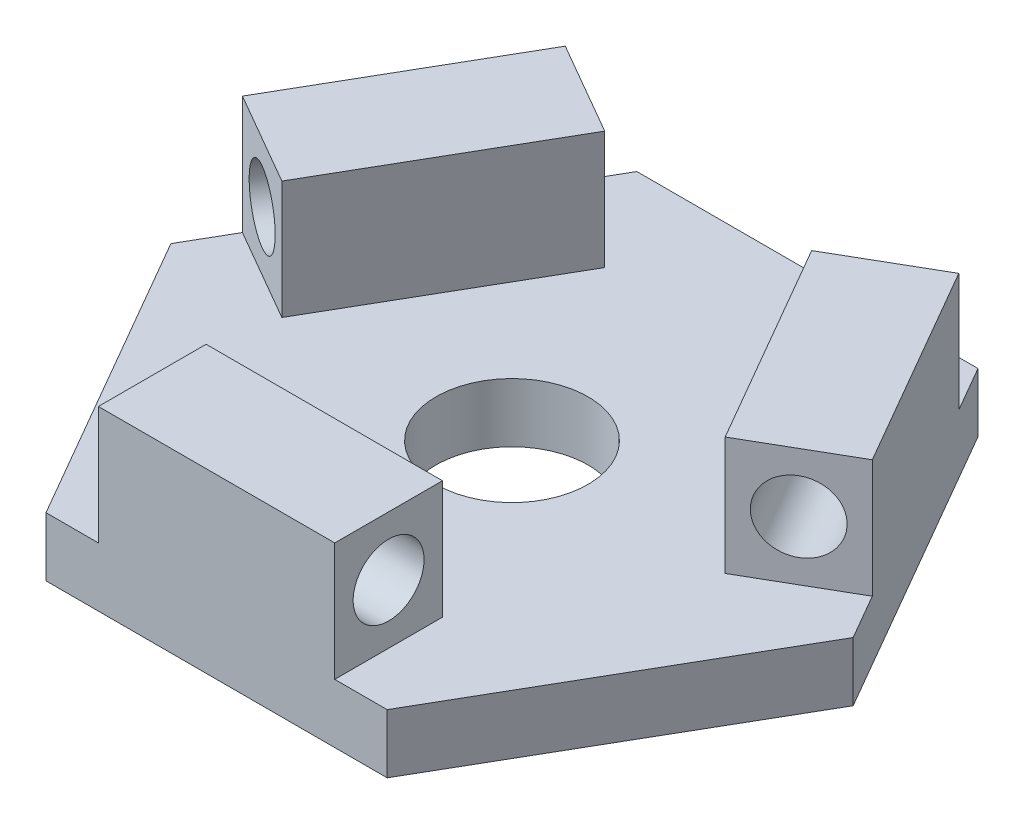
ISO-10303-21;
HEADER;
FILE_DESCRIPTION(('STEP AP214'),'2;1');
FILE_NAME('part.step','',(''),(''),'','','');
FILE_SCHEMA(('AUTOMOTIVE_DESIGN { 1 0 10303 214 1 1 1 1 }'));
ENDSEC;
DATA;
#1=APPLICATION_CONTEXT('core data for automotive mechanical design processes');
#2=APPLICATION_PROTOCOL_DEFINITION('international standard','automotive_design',2000,#1);
#3=PRODUCT_CONTEXT('',#1,'mechanical');
#4=PRODUCT('Part','Part','',(#3));
#5=PRODUCT_RELATED_PRODUCT_CATEGORY('part','',(#4));
#6=PRODUCT_DEFINITION_FORMATION('','',#4);
#7=PRODUCT_DEFINITION_CONTEXT('part definition',#1,'design');
#8=PRODUCT_DEFINITION('design','',#6,#7);
#9=PRODUCT_DEFINITION_SHAPE('','',#8);
#10=(LENGTH_UNIT() NAMED_UNIT(*) SI_UNIT(.MILLI.,.METRE.));
#11=(NAMED_UNIT(*) PLANE_ANGLE_UNIT() SI_UNIT($,.RADIAN.));
#12=(NAMED_UNIT(*) SI_UNIT($,.STERADIAN.) SOLID_ANGLE_UNIT());
#13=UNCERTAINTY_MEASURE_WITH_UNIT(LENGTH_MEASURE(1.E-05),#10,'distance_accuracy_value','');
#14=(GEOMETRIC_REPRESENTATION_CONTEXT(3) GLOBAL_UNCERTAINTY_ASSIGNED_CONTEXT((#13)) GLOBAL_UNIT_ASSIGNED_CONTEXT((#10,
#11,#12)) REPRESENTATION_CONTEXT('',''));
#15=CARTESIAN_POINT('',(0.,0.,0.));
#16=DIRECTION('',(0.,0.,1.));
#17=DIRECTION('',(1.,0.,0.));
#18=AXIS2_PLACEMENT_3D('',#15,#16,#17);
#19=CARTESIAN_POINT('',(0.,5.,0.));
#20=DIRECTION('',(0.,1.,0.));
#21=DIRECTION('',(0.,0.,1.));
#22=AXIS2_PLACEMENT_3D('',#19,#20,#21);
#23=PLANE('',#22);
#24=CARTESIAN_POINT('',(0.,5.,0.));
#25=DIRECTION('',(0.,1.,0.));
#26=DIRECTION('',(0.,0.,1.));
#27=AXIS2_PLACEMENT_3D('',#24,#25,#26);
#28=CIRCLE('',#27,6.43081059740745);
#29=CARTESIAN_POINT('',(0.,5.,6.43081059740745));
#30=VERTEX_POINT('',#29);
#31=EDGE_CURVE('E366',#30,#30,#28,.T.);
#32=ORIENTED_EDGE('',*,*,#31,.F.);
#33=EDGE_LOOP('',(#32));
#34=FACE_BOUND('',#33,.T.);
#35=DIRECTION('',(0.499999999999992,0.,-0.866025403784443));
#36=VECTOR('',#35,1.);
#37=CARTESIAN_POINT('',(-8.75565067167578,5.,-16.6020826560147));
#38=LINE('',#37,#36);
#39=CARTESIAN_POINT('',(-18.7556506716756,5.,0.718425419674186));
#40=VERTEX_POINT('',#39);
#41=CARTESIAN_POINT('',(-8.75565067167578,5.,-16.6020826560147));
#42=VERTEX_POINT('',#41);
#43=EDGE_CURVE('E52',#40,#42,#38,.T.);
#44=ORIENTED_EDGE('',*,*,#43,.F.);
#45=DIRECTION('',(0.866025403784443,0.,0.499999999999992));
#46=VECTOR('',#45,1.);
#47=CARTESIAN_POINT('',(-18.7556506716756,5.,0.718425419674186));
#48=LINE('',#47,#46);
#49=CARTESIAN_POINT('',(-26.650635094611,5.,-3.83974596215537));
#50=VERTEX_POINT('',#49);
#51=EDGE_CURVE('E182',#50,#40,#48,.T.);
#52=ORIENTED_EDGE('',*,*,#51,.F.);
#53=DIRECTION('',(-0.5,0.,0.866025403784439));
#54=VECTOR('',#53,1.);
#55=CARTESIAN_POINT('',(-14.4337567297406,5.,-25.));
#56=LINE('',#55,#54);
#57=CARTESIAN_POINT('',(-28.8675134594813,5.,0.));
#58=VERTEX_POINT('',#57);
#59=EDGE_CURVE('E389',#50,#58,#56,.T.);
#60=ORIENTED_EDGE('',*,*,#59,.T.);
#61=DIRECTION('',(0.5,0.,0.866025403784438));
#62=VECTOR('',#61,1.);
#63=CARTESIAN_POINT('',(-28.8675134594813,5.,0.));
#64=LINE('',#63,#62);
#65=CARTESIAN_POINT('',(-14.4337567297406,5.,25.));
#66=VERTEX_POINT('',#65);
#67=EDGE_CURVE('E375',#58,#66,#64,.T.);
#68=ORIENTED_EDGE('',*,*,#67,.T.);
#69=DIRECTION('',(1.,0.,0.));
#70=VECTOR('',#69,1.);
#71=CARTESIAN_POINT('',(-14.4337567297406,5.,25.));
#72=LINE('',#71,#70);
#73=CARTESIAN_POINT('',(-9.99999999999999,5.,25.));
#74=VERTEX_POINT('',#73);
#75=EDGE_CURVE('E367',#66,#74,#72,.T.);
#76=ORIENTED_EDGE('',*,*,#75,.T.);
#77=DIRECTION('',(0.,0.,1.));
#78=VECTOR('',#77,1.);
#79=CARTESIAN_POINT('',(-10.,5.,15.8836572363408));
#80=LINE('',#79,#78);
#81=CARTESIAN_POINT('',(-10.,5.,15.8836572363408));
#82=VERTEX_POINT('',#81);
#83=EDGE_CURVE('E226',#82,#74,#80,.T.);
#84=ORIENTED_EDGE('',*,*,#83,.F.);
#85=DIRECTION('',(-1.,0.,0.));
#86=VECTOR('',#85,1.);
#87=CARTESIAN_POINT('',(-10.,5.,15.8836572363408));
#88=LINE('',#87,#86);
#89=CARTESIAN_POINT('',(10.,5.,15.8836572363408));
#90=VERTEX_POINT('',#89);
#91=EDGE_CURVE('E233',#90,#82,#88,.T.);
#92=ORIENTED_EDGE('',*,*,#91,.F.);
#93=DIRECTION('',(0.,0.,-1.));
#94=VECTOR('',#93,1.);
#95=CARTESIAN_POINT('',(10.,5.,15.8836572363408));
#96=LINE('',#95,#94);
#97=CARTESIAN_POINT('',(10.,5.,25.));
#98=VERTEX_POINT('',#97);
#99=EDGE_CURVE('E236',#98,#90,#96,.T.);
#100=ORIENTED_EDGE('',*,*,#99,.F.);
#101=CARTESIAN_POINT('',(14.4337567297407,5.,25.));
#102=VERTEX_POINT('',#101);
#103=EDGE_CURVE('E370',#98,#102,#72,.T.);
#104=ORIENTED_EDGE('',*,*,#103,.T.);
#105=DIRECTION('',(0.5,0.,-0.866025403784439));
#106=VECTOR('',#105,1.);
#107=CARTESIAN_POINT('',(14.4337567297407,5.,25.));
#108=LINE('',#107,#106);
#109=CARTESIAN_POINT('',(28.8675134594813,5.,0.));
#110=VERTEX_POINT('',#109);
#111=EDGE_CURVE('E356',#102,#110,#108,.T.);
#112=ORIENTED_EDGE('',*,*,#111,.T.);
#113=DIRECTION('',(-0.5,0.,-0.866025403784439));
#114=VECTOR('',#113,1.);
#115=CARTESIAN_POINT('',(28.8675134594813,5.,0.));
#116=LINE('',#115,#114);
#117=CARTESIAN_POINT('',(26.6506350946109,5.,-3.83974596215572));
#118=VERTEX_POINT('',#117);
#119=EDGE_CURVE('E391',#110,#118,#116,.T.);
#120=ORIENTED_EDGE('',*,*,#119,.T.);
#121=DIRECTION('',(0.866025403784436,0.,-0.500000000000004));
#122=VECTOR('',#121,1.);
#123=CARTESIAN_POINT('',(18.7556506716756,5.,0.718425419673921));
#124=LINE('',#123,#122);
#125=CARTESIAN_POINT('',(18.7556506716756,5.,0.718425419673922));
#126=VERTEX_POINT('',#125);
#127=EDGE_CURVE('E196',#126,#118,#124,.T.);
#128=ORIENTED_EDGE('',*,*,#127,.F.);
#129=DIRECTION('',(0.500000000000004,0.,0.866025403784437));
#130=VECTOR('',#129,1.);
#131=CARTESIAN_POINT('',(18.7556506716756,5.,0.718425419673921));
#132=LINE('',#131,#130);
#133=CARTESIAN_POINT('',(8.75565067167555,5.,-16.6020826560148));
#134=VERTEX_POINT('',#133);
#135=EDGE_CURVE('E186',#134,#126,#132,.T.);
#136=ORIENTED_EDGE('',*,*,#135,.F.);
#137=DIRECTION('',(-0.866025403784436,0.,0.500000000000004));
#138=VECTOR('',#137,1.);
#139=CARTESIAN_POINT('',(8.75565067167555,5.,-16.6020826560148));
#140=LINE('',#139,#138);
#141=CARTESIAN_POINT('',(16.6506350946109,5.,-21.1602540378445));
#142=VERTEX_POINT('',#141);
#143=EDGE_CURVE('E183',#142,#134,#140,.T.);
#144=ORIENTED_EDGE('',*,*,#143,.F.);
#145=CARTESIAN_POINT('',(14.4337567297406,5.,-25.));
#146=VERTEX_POINT('',#145);
#147=EDGE_CURVE('E351',#142,#146,#116,.T.);
#148=ORIENTED_EDGE('',*,*,#147,.T.);
#149=DIRECTION('',(-1.,0.,0.));
#150=VECTOR('',#149,1.);
#151=CARTESIAN_POINT('',(14.4337567297406,5.,-25.));
#152=LINE('',#151,#150);
#153=CARTESIAN_POINT('',(-14.4337567297406,5.,-25.));
#154=VERTEX_POINT('',#153);
#155=EDGE_CURVE('E390',#146,#154,#152,.T.);
#156=ORIENTED_EDGE('',*,*,#155,.T.);
#157=CARTESIAN_POINT('',(-16.650635094611,5.,-21.1602540378442));
#158=VERTEX_POINT('',#157);
#159=EDGE_CURVE('E278',#154,#158,#56,.T.);
#160=ORIENTED_EDGE('',*,*,#159,.T.);
#161=DIRECTION('',(-0.866025403784443,0.,-0.499999999999992));
#162=VECTOR('',#161,1.);
#163=CARTESIAN_POINT('',(-8.75565067167578,5.,-16.6020826560147));
#164=LINE('',#163,#162);
#165=EDGE_CURVE('E57',#42,#158,#164,.T.);
#166=ORIENTED_EDGE('',*,*,#165,.F.);
#167=EDGE_LOOP('',(#44,#52,#60,#68,#76,#84,#92,#100,#104,#112,#120,#128,#136,#144,#148,#156,
#160,#166));
#168=FACE_BOUND('',#167,.T.);
#169=ADVANCED_FACE('F35',(#34,#168),#23,.T.);
#170=CARTESIAN_POINT('',(28.8675134594813,5.,0.));
#171=DIRECTION('',(-0.866025403784439,0.,0.5));
#172=DIRECTION('',(0.5,0.,0.866025403784439));
#173=AXIS2_PLACEMENT_3D('',#170,#171,#172);
#174=PLANE('',#173);
#175=DIRECTION('',(-0.5,0.,-0.866025403784439));
#176=VECTOR('',#175,1.);
#177=CARTESIAN_POINT('',(28.8675134594813,0.,0.));
#178=LINE('',#177,#176);
#179=CARTESIAN_POINT('',(28.8675134594813,0.,0.));
#180=VERTEX_POINT('',#179);
#181=CARTESIAN_POINT('',(14.4337567297406,0.,-25.));
#182=VERTEX_POINT('',#181);
#183=EDGE_CURVE('E334',#180,#182,#178,.T.);
#184=ORIENTED_EDGE('',*,*,#183,.T.);
#185=DIRECTION('',(0.,-1.,0.));
#186=VECTOR('',#185,1.);
#187=CARTESIAN_POINT('',(14.4337567297406,5.,-25.));
#188=LINE('',#187,#186);
#189=EDGE_CURVE('E11',#146,#182,#188,.T.);
#190=ORIENTED_EDGE('',*,*,#189,.F.);
#191=ORIENTED_EDGE('',*,*,#147,.F.);
#192=DIRECTION('',(0.,-1.,0.));
#193=VECTOR('',#192,1.);
#194=CARTESIAN_POINT('',(16.6506350946109,15.,-21.1602540378445));
#195=LINE('',#194,#193);
#196=CARTESIAN_POINT('',(16.6506350946109,15.,-21.1602540378445));
#197=VERTEX_POINT('',#196);
#198=EDGE_CURVE('E201',#197,#142,#195,.T.);
#199=ORIENTED_EDGE('',*,*,#198,.F.);
#200=DIRECTION('',(-0.500000000000004,0.,-0.866025403784436));
#201=VECTOR('',#200,1.);
#202=CARTESIAN_POINT('',(26.650635094611,15.,-3.83974596215575));
#203=LINE('',#202,#201);
#204=CARTESIAN_POINT('',(26.650635094611,15.,-3.83974596215575));
#205=VERTEX_POINT('',#204);
#206=EDGE_CURVE('E200',#205,#197,#203,.T.);
#207=ORIENTED_EDGE('',*,*,#206,.F.);
#208=DIRECTION('',(0.,-1.,0.));
#209=VECTOR('',#208,1.);
#210=CARTESIAN_POINT('',(26.650635094611,15.,-3.83974596215575));
#211=LINE('',#210,#209);
#212=EDGE_CURVE('E209',#205,#118,#211,.T.);
#213=ORIENTED_EDGE('',*,*,#212,.T.);
#214=ORIENTED_EDGE('',*,*,#119,.F.);
#215=DIRECTION('',(0.,-1.,0.));
#216=VECTOR('',#215,1.);
#217=CARTESIAN_POINT('',(28.8675134594813,5.,0.));
#218=LINE('',#217,#216);
#219=EDGE_CURVE('E352',#110,#180,#218,.T.);
#220=ORIENTED_EDGE('',*,*,#219,.T.);
#221=EDGE_LOOP('',(#184,#190,#191,#199,#207,#213,#214,#220));
#222=FACE_BOUND('',#221,.T.);
#223=ADVANCED_FACE('F37',(#222),#174,.F.);
#224=CARTESIAN_POINT('',(14.4337567297406,5.,-25.));
#225=DIRECTION('',(0.,0.,1.));
#226=DIRECTION('',(1.,0.,0.));
#227=AXIS2_PLACEMENT_3D('',#224,#225,#226);
#228=PLANE('',#227);
#229=DIRECTION('',(-1.,0.,0.));
#230=VECTOR('',#229,1.);
#231=CARTESIAN_POINT('',(14.4337567297406,0.,-25.));
#232=LINE('',#231,#230);
#233=CARTESIAN_POINT('',(-14.4337567297406,0.,-25.));
#234=VERTEX_POINT('',#233);
#235=EDGE_CURVE('E326',#182,#234,#232,.T.);
#236=ORIENTED_EDGE('',*,*,#235,.T.);
#237=DIRECTION('',(0.,-1.,0.));
#238=VECTOR('',#237,1.);
#239=CARTESIAN_POINT('',(-14.4337567297406,5.,-25.));
#240=LINE('',#239,#238);
#241=EDGE_CURVE('E44',#154,#234,#240,.T.);
#242=ORIENTED_EDGE('',*,*,#241,.F.);
#243=ORIENTED_EDGE('',*,*,#155,.F.);
#244=ORIENTED_EDGE('',*,*,#189,.T.);
#245=EDGE_LOOP('',(#236,#242,#243,#244));
#246=FACE_BOUND('',#245,.T.);
#247=ADVANCED_FACE('F297',(#246),#228,.F.);
#248=CARTESIAN_POINT('',(-14.4337567297406,5.,-25.));
#249=DIRECTION('',(0.866025403784439,0.,0.5));
#250=DIRECTION('',(0.5,0.,-0.866025403784439));
#251=AXIS2_PLACEMENT_3D('',#248,#249,#250);
#252=PLANE('',#251);
#253=DIRECTION('',(-0.5,0.,0.866025403784439));
#254=VECTOR('',#253,1.);
#255=CARTESIAN_POINT('',(-14.4337567297406,0.,-25.));
#256=LINE('',#255,#254);
#257=CARTESIAN_POINT('',(-28.8675134594813,0.,0.));
#258=VERTEX_POINT('',#257);
#259=EDGE_CURVE('E333',#234,#258,#256,.T.);
#260=ORIENTED_EDGE('',*,*,#259,.T.);
#261=DIRECTION('',(0.,-1.,0.));
#262=VECTOR('',#261,1.);
#263=CARTESIAN_POINT('',(-28.8675134594813,5.,0.));
#264=LINE('',#263,#262);
#265=EDGE_CURVE('E338',#58,#258,#264,.T.);
#266=ORIENTED_EDGE('',*,*,#265,.F.);
#267=ORIENTED_EDGE('',*,*,#59,.F.);
#268=DIRECTION('',(0.,-1.,0.));
#269=VECTOR('',#268,1.);
#270=CARTESIAN_POINT('',(-26.650635094611,15.,-3.83974596215537));
#271=LINE('',#270,#269);
#272=CARTESIAN_POINT('',(-26.650635094611,15.,-3.83974596215537));
#273=VERTEX_POINT('',#272);
#274=EDGE_CURVE('E268',#273,#50,#271,.T.);
#275=ORIENTED_EDGE('',*,*,#274,.F.);
#276=DIRECTION('',(-0.499999999999992,0.,0.866025403784443));
#277=VECTOR('',#276,1.);
#278=CARTESIAN_POINT('',(-16.6506350946112,15.,-21.1602540378442));
#279=LINE('',#278,#277);
#280=CARTESIAN_POINT('',(-16.6506350946112,15.,-21.1602540378442));
#281=VERTEX_POINT('',#280);
#282=EDGE_CURVE('E176',#281,#273,#279,.T.);
#283=ORIENTED_EDGE('',*,*,#282,.F.);
#284=DIRECTION('',(0.,-1.,0.));
#285=VECTOR('',#284,1.);
#286=CARTESIAN_POINT('',(-16.6506350946112,15.,-21.1602540378442));
#287=LINE('',#286,#285);
#288=EDGE_CURVE('E188',#281,#158,#287,.T.);
#289=ORIENTED_EDGE('',*,*,#288,.T.);
#290=ORIENTED_EDGE('',*,*,#159,.F.);
#291=ORIENTED_EDGE('',*,*,#241,.T.);
#292=EDGE_LOOP('',(#260,#266,#267,#275,#283,#289,#290,#291));
#293=FACE_BOUND('',#292,.T.);
#294=ADVANCED_FACE('F276',(#293),#252,.F.);
#295=CARTESIAN_POINT('',(-28.8675134594813,5.,0.));
#296=DIRECTION('',(0.866025403784438,0.,-0.5));
#297=DIRECTION('',(-0.5,0.,-0.866025403784438));
#298=AXIS2_PLACEMENT_3D('',#295,#296,#297);
#299=PLANE('',#298);
#300=DIRECTION('',(0.5,0.,0.866025403784438));
#301=VECTOR('',#300,1.);
#302=CARTESIAN_POINT('',(-28.8675134594813,0.,0.));
#303=LINE('',#302,#301);
#304=CARTESIAN_POINT('',(-14.4337567297406,0.,25.));
#305=VERTEX_POINT('',#304);
#306=EDGE_CURVE('E342',#258,#305,#303,.T.);
#307=ORIENTED_EDGE('',*,*,#306,.T.);
#308=DIRECTION('',(0.,-1.,0.));
#309=VECTOR('',#308,1.);
#310=CARTESIAN_POINT('',(-14.4337567297406,5.,25.));
#311=LINE('',#310,#309);
#312=EDGE_CURVE('E359',#66,#305,#311,.T.);
#313=ORIENTED_EDGE('',*,*,#312,.F.);
#314=ORIENTED_EDGE('',*,*,#67,.F.);
#315=ORIENTED_EDGE('',*,*,#265,.T.);
#316=EDGE_LOOP('',(#307,#313,#314,#315));
#317=FACE_BOUND('',#316,.T.);
#318=ADVANCED_FACE('F315',(#317),#299,.F.);
#319=CARTESIAN_POINT('',(-14.4337567297406,5.,25.));
#320=DIRECTION('',(0.,0.,-1.));
#321=DIRECTION('',(-1.,0.,0.));
#322=AXIS2_PLACEMENT_3D('',#319,#320,#321);
#323=PLANE('',#322);
#324=DIRECTION('',(1.,0.,0.));
#325=VECTOR('',#324,1.);
#326=CARTESIAN_POINT('',(-14.4337567297406,0.,25.));
#327=LINE('',#326,#325);
#328=CARTESIAN_POINT('',(14.4337567297407,0.,25.));
#329=VERTEX_POINT('',#328);
#330=EDGE_CURVE('E344',#305,#329,#327,.T.);
#331=ORIENTED_EDGE('',*,*,#330,.T.);
#332=DIRECTION('',(0.,-1.,0.));
#333=VECTOR('',#332,1.);
#334=CARTESIAN_POINT('',(14.4337567297407,5.,25.));
#335=LINE('',#334,#333);
#336=EDGE_CURVE('E355',#102,#329,#335,.T.);
#337=ORIENTED_EDGE('',*,*,#336,.F.);
#338=ORIENTED_EDGE('',*,*,#103,.F.);
#339=DIRECTION('',(0.,-1.,0.));
#340=VECTOR('',#339,1.);
#341=CARTESIAN_POINT('',(10.,15.,25.));
#342=LINE('',#341,#340);
#343=CARTESIAN_POINT('',(10.,15.,25.));
#344=VERTEX_POINT('',#343);
#345=EDGE_CURVE('E232',#344,#98,#342,.T.);
#346=ORIENTED_EDGE('',*,*,#345,.F.);
#347=DIRECTION('',(1.,0.,0.));
#348=VECTOR('',#347,1.);
#349=CARTESIAN_POINT('',(-9.99999999999999,15.,25.));
#350=LINE('',#349,#348);
#351=CARTESIAN_POINT('',(-9.99999999999999,15.,25.));
#352=VERTEX_POINT('',#351);
#353=EDGE_CURVE('E230',#352,#344,#350,.T.);
#354=ORIENTED_EDGE('',*,*,#353,.F.);
#355=DIRECTION('',(0.,-1.,0.));
#356=VECTOR('',#355,1.);
#357=CARTESIAN_POINT('',(-9.99999999999999,15.,25.));
#358=LINE('',#357,#356);
#359=EDGE_CURVE('E247',#352,#74,#358,.T.);
#360=ORIENTED_EDGE('',*,*,#359,.T.);
#361=ORIENTED_EDGE('',*,*,#75,.F.);
#362=ORIENTED_EDGE('',*,*,#312,.T.);
#363=EDGE_LOOP('',(#331,#337,#338,#346,#354,#360,#361,#362));
#364=FACE_BOUND('',#363,.T.);
#365=ADVANCED_FACE('F311',(#364),#323,.F.);
#366=CARTESIAN_POINT('',(14.4337567297407,5.,25.));
#367=DIRECTION('',(-0.866025403784439,0.,-0.5));
#368=DIRECTION('',(-0.5,0.,0.866025403784439));
#369=AXIS2_PLACEMENT_3D('',#366,#367,#368);
#370=PLANE('',#369);
#371=DIRECTION('',(0.5,0.,-0.866025403784439));
#372=VECTOR('',#371,1.);
#373=CARTESIAN_POINT('',(14.4337567297407,0.,25.));
#374=LINE('',#373,#372);
#375=EDGE_CURVE('E349',#329,#180,#374,.T.);
#376=ORIENTED_EDGE('',*,*,#375,.T.);
#377=ORIENTED_EDGE('',*,*,#219,.F.);
#378=ORIENTED_EDGE('',*,*,#111,.F.);
#379=ORIENTED_EDGE('',*,*,#336,.T.);
#380=EDGE_LOOP('',(#376,#377,#378,#379));
#381=FACE_BOUND('',#380,.T.);
#382=ADVANCED_FACE('F307',(#381),#370,.F.);
#383=CARTESIAN_POINT('',(0.,0.,0.));
#384=DIRECTION('',(0.,1.,0.));
#385=DIRECTION('',(0.,0.,1.));
#386=AXIS2_PLACEMENT_3D('',#383,#384,#385);
#387=PLANE('',#386);
#388=CARTESIAN_POINT('',(0.,0.,0.));
#389=DIRECTION('',(0.,1.,0.));
#390=DIRECTION('',(0.,0.,1.));
#391=AXIS2_PLACEMENT_3D('',#388,#389,#390);
#392=CIRCLE('',#391,6.43081059740745);
#393=CARTESIAN_POINT('',(0.,0.,6.43081059740745));
#394=VERTEX_POINT('',#393);
#395=EDGE_CURVE('E363',#394,#394,#392,.T.);
#396=ORIENTED_EDGE('',*,*,#395,.T.);
#397=EDGE_LOOP('',(#396));
#398=FACE_BOUND('',#397,.T.);
#399=ORIENTED_EDGE('',*,*,#183,.F.);
#400=ORIENTED_EDGE('',*,*,#375,.F.);
#401=ORIENTED_EDGE('',*,*,#330,.F.);
#402=ORIENTED_EDGE('',*,*,#306,.F.);
#403=ORIENTED_EDGE('',*,*,#259,.F.);
#404=ORIENTED_EDGE('',*,*,#235,.F.);
#405=EDGE_LOOP('',(#399,#400,#401,#402,#403,#404));
#406=FACE_BOUND('',#405,.T.);
#407=ADVANCED_FACE('F304',(#398,#406),#387,.F.);
#408=CARTESIAN_POINT('',(0.,-5.,0.));
#409=DIRECTION('',(0.,1.,0.));
#410=DIRECTION('',(0.,0.,1.));
#411=AXIS2_PLACEMENT_3D('',#408,#409,#410);
#412=CYLINDRICAL_SURFACE('',#411,6.43081059740745);
#413=ORIENTED_EDGE('',*,*,#31,.T.);
#414=EDGE_LOOP('',(#413));
#415=FACE_BOUND('',#414,.T.);
#416=ORIENTED_EDGE('',*,*,#395,.F.);
#417=EDGE_LOOP('',(#416));
#418=FACE_BOUND('',#417,.T.);
#419=ADVANCED_FACE('F302',(#415,#418),#412,.F.);
#420=CARTESIAN_POINT('',(10.,15.,15.8836572363408));
#421=DIRECTION('',(-1.,0.,0.));
#422=DIRECTION('',(0.,0.,1.));
#423=AXIS2_PLACEMENT_3D('',#420,#421,#422);
#424=PLANE('',#423);
#425=CARTESIAN_POINT('',(10.,10.,20.4418286181704));
#426=DIRECTION('',(1.,0.,0.));
#427=DIRECTION('',(0.,0.,-1.));
#428=AXIS2_PLACEMENT_3D('',#425,#426,#427);
#429=CIRCLE('',#428,3.);
#430=CARTESIAN_POINT('',(10.,10.,17.4418286181704));
#431=VERTEX_POINT('',#430);
#432=EDGE_CURVE('E218',#431,#431,#429,.T.);
#433=ORIENTED_EDGE('',*,*,#432,.F.);
#434=EDGE_LOOP('',(#433));
#435=FACE_BOUND('',#434,.T.);
#436=ORIENTED_EDGE('',*,*,#99,.T.);
#437=DIRECTION('',(0.,-1.,0.));
#438=VECTOR('',#437,1.);
#439=CARTESIAN_POINT('',(10.,15.,15.8836572363408));
#440=LINE('',#439,#438);
#441=CARTESIAN_POINT('',(10.,15.,15.8836572363408));
#442=VERTEX_POINT('',#441);
#443=EDGE_CURVE('E396',#442,#90,#440,.T.);
#444=ORIENTED_EDGE('',*,*,#443,.F.);
#445=DIRECTION('',(0.,0.,-1.));
#446=VECTOR('',#445,1.);
#447=CARTESIAN_POINT('',(10.,15.,15.8836572363408));
#448=LINE('',#447,#446);
#449=EDGE_CURVE('E222',#344,#442,#448,.T.);
#450=ORIENTED_EDGE('',*,*,#449,.F.);
#451=ORIENTED_EDGE('',*,*,#345,.T.);
#452=EDGE_LOOP('',(#436,#444,#450,#451));
#453=FACE_BOUND('',#452,.T.);
#454=ADVANCED_FACE('F445',(#435,#453),#424,.F.);
#455=CARTESIAN_POINT('',(-10.,15.,15.8836572363408));
#456=DIRECTION('',(0.,0.,1.));
#457=DIRECTION('',(1.,0.,0.));
#458=AXIS2_PLACEMENT_3D('',#455,#456,#457);
#459=PLANE('',#458);
#460=ORIENTED_EDGE('',*,*,#91,.T.);
#461=DIRECTION('',(0.,-1.,0.));
#462=VECTOR('',#461,1.);
#463=CARTESIAN_POINT('',(-10.,15.,15.8836572363408));
#464=LINE('',#463,#462);
#465=CARTESIAN_POINT('',(-10.,15.,15.8836572363408));
#466=VERTEX_POINT('',#465);
#467=EDGE_CURVE('E239',#466,#82,#464,.T.);
#468=ORIENTED_EDGE('',*,*,#467,.F.);
#469=DIRECTION('',(-1.,0.,0.));
#470=VECTOR('',#469,1.);
#471=CARTESIAN_POINT('',(-10.,15.,15.8836572363408));
#472=LINE('',#471,#470);
#473=EDGE_CURVE('E225',#442,#466,#472,.T.);
#474=ORIENTED_EDGE('',*,*,#473,.F.);
#475=ORIENTED_EDGE('',*,*,#443,.T.);
#476=EDGE_LOOP('',(#460,#468,#474,#475));
#477=FACE_BOUND('',#476,.T.);
#478=ADVANCED_FACE('F407',(#477),#459,.F.);
#479=CARTESIAN_POINT('',(-10.,15.,15.8836572363408));
#480=DIRECTION('',(1.,0.,0.));
#481=DIRECTION('',(0.,0.,-1.));
#482=AXIS2_PLACEMENT_3D('',#479,#480,#481);
#483=PLANE('',#482);
#484=CARTESIAN_POINT('',(-10.,10.,20.4418286181704));
#485=DIRECTION('',(1.,0.,0.));
#486=DIRECTION('',(0.,0.,-1.));
#487=AXIS2_PLACEMENT_3D('',#484,#485,#486);
#488=CIRCLE('',#487,3.);
#489=CARTESIAN_POINT('',(-10.,10.,17.4418286181704));
#490=VERTEX_POINT('',#489);
#491=EDGE_CURVE('E221',#490,#490,#488,.T.);
#492=ORIENTED_EDGE('',*,*,#491,.T.);
#493=EDGE_LOOP('',(#492));
#494=FACE_BOUND('',#493,.T.);
#495=ORIENTED_EDGE('',*,*,#83,.T.);
#496=ORIENTED_EDGE('',*,*,#359,.F.);
#497=DIRECTION('',(0.,0.,1.));
#498=VECTOR('',#497,1.);
#499=CARTESIAN_POINT('',(-10.,15.,15.8836572363408));
#500=LINE('',#499,#498);
#501=EDGE_CURVE('E228',#466,#352,#500,.T.);
#502=ORIENTED_EDGE('',*,*,#501,.F.);
#503=ORIENTED_EDGE('',*,*,#467,.T.);
#504=EDGE_LOOP('',(#495,#496,#502,#503));
#505=FACE_BOUND('',#504,.T.);
#506=ADVANCED_FACE('F405',(#494,#505),#483,.F.);
#507=CARTESIAN_POINT('',(0.,15.,0.));
#508=DIRECTION('',(0.,1.,0.));
#509=DIRECTION('',(0.,0.,1.));
#510=AXIS2_PLACEMENT_3D('',#507,#508,#509);
#511=PLANE('',#510);
#512=ORIENTED_EDGE('',*,*,#449,.T.);
#513=ORIENTED_EDGE('',*,*,#473,.T.);
#514=ORIENTED_EDGE('',*,*,#501,.T.);
#515=ORIENTED_EDGE('',*,*,#353,.T.);
#516=EDGE_LOOP('',(#512,#513,#514,#515));
#517=FACE_BOUND('',#516,.T.);
#518=ADVANCED_FACE('F433',(#517),#511,.T.);
#519=CARTESIAN_POINT('',(-28.8675134594813,10.,20.4418286181704));
#520=DIRECTION('',(1.,0.,0.));
#521=DIRECTION('',(0.,0.,-1.));
#522=AXIS2_PLACEMENT_3D('',#519,#520,#521);
#523=CYLINDRICAL_SURFACE('',#522,3.);
#524=ORIENTED_EDGE('',*,*,#432,.T.);
#525=EDGE_LOOP('',(#524));
#526=FACE_BOUND('',#525,.T.);
#527=ORIENTED_EDGE('',*,*,#491,.F.);
#528=EDGE_LOOP('',(#527));
#529=FACE_BOUND('',#528,.T.);
#530=ADVANCED_FACE('F425',(#526,#529),#523,.F.);
#531=CARTESIAN_POINT('',(8.75565067167555,15.,-16.6020826560148));
#532=DIRECTION('',(0.500000000000004,0.,0.866025403784436));
#533=DIRECTION('',(0.866025403784436,0.,-0.500000000000004));
#534=AXIS2_PLACEMENT_3D('',#531,#532,#533);
#535=PLANE('',#534);
#536=CARTESIAN_POINT('',(12.7031428831432,10.,-18.8811683469296));
#537=DIRECTION('',(-0.500000000000004,0.,-0.866025403784436));
#538=DIRECTION('',(-0.866025403784436,0.,0.500000000000004));
#539=AXIS2_PLACEMENT_3D('',#536,#537,#538);
#540=CIRCLE('',#539,3.);
#541=CARTESIAN_POINT('',(10.1050666717899,10.,-17.3811683469296));
#542=VERTEX_POINT('',#541);
#543=EDGE_CURVE('E255',#542,#542,#540,.T.);
#544=ORIENTED_EDGE('',*,*,#543,.F.);
#545=EDGE_LOOP('',(#544));
#546=FACE_BOUND('',#545,.T.);
#547=ORIENTED_EDGE('',*,*,#143,.T.);
#548=DIRECTION('',(0.,-1.,0.));
#549=VECTOR('',#548,1.);
#550=CARTESIAN_POINT('',(8.75565067167555,15.,-16.6020826560148));
#551=LINE('',#550,#549);
#552=CARTESIAN_POINT('',(8.75565067167555,15.,-16.6020826560148));
#553=VERTEX_POINT('',#552);
#554=EDGE_CURVE('E215',#553,#134,#551,.T.);
#555=ORIENTED_EDGE('',*,*,#554,.F.);
#556=DIRECTION('',(-0.866025403784436,0.,0.500000000000004));
#557=VECTOR('',#556,1.);
#558=CARTESIAN_POINT('',(8.75565067167555,15.,-16.6020826560148));
#559=LINE('',#558,#557);
#560=EDGE_CURVE('E192',#197,#553,#559,.T.);
#561=ORIENTED_EDGE('',*,*,#560,.F.);
#562=ORIENTED_EDGE('',*,*,#198,.T.);
#563=EDGE_LOOP('',(#547,#555,#561,#562));
#564=FACE_BOUND('',#563,.T.);
#565=ADVANCED_FACE('F423',(#546,#564),#535,.F.);
#566=CARTESIAN_POINT('',(18.7556506716756,15.,0.718425419673921));
#567=DIRECTION('',(0.866025403784436,0.,-0.500000000000004));
#568=DIRECTION('',(-0.500000000000004,0.,-0.866025403784436));
#569=AXIS2_PLACEMENT_3D('',#566,#567,#568);
#570=PLANE('',#569);
#571=ORIENTED_EDGE('',*,*,#135,.T.);
#572=DIRECTION('',(0.,-1.,0.));
#573=VECTOR('',#572,1.);
#574=CARTESIAN_POINT('',(18.7556506716756,15.,0.718425419673921));
#575=LINE('',#574,#573);
#576=CARTESIAN_POINT('',(18.7556506716756,15.,0.718425419673921));
#577=VERTEX_POINT('',#576);
#578=EDGE_CURVE('E212',#577,#126,#575,.T.);
#579=ORIENTED_EDGE('',*,*,#578,.F.);
#580=DIRECTION('',(0.500000000000004,0.,0.866025403784437));
#581=VECTOR('',#580,1.);
#582=CARTESIAN_POINT('',(18.7556506716756,15.,0.718425419673921));
#583=LINE('',#582,#581);
#584=EDGE_CURVE('E195',#553,#577,#583,.T.);
#585=ORIENTED_EDGE('',*,*,#584,.F.);
#586=ORIENTED_EDGE('',*,*,#554,.T.);
#587=EDGE_LOOP('',(#571,#579,#585,#586));
#588=FACE_BOUND('',#587,.T.);
#589=ADVANCED_FACE('F420',(#588),#570,.F.);
#590=CARTESIAN_POINT('',(18.7556506716756,15.,0.718425419673921));
#591=DIRECTION('',(-0.500000000000004,0.,-0.866025403784436));
#592=DIRECTION('',(-0.866025403784436,0.,0.500000000000004));
#593=AXIS2_PLACEMENT_3D('',#590,#591,#592);
#594=PLANE('',#593);
#595=CARTESIAN_POINT('',(22.7031428831433,10.,-1.56066027124092));
#596=DIRECTION('',(-0.500000000000004,0.,-0.866025403784436));
#597=DIRECTION('',(-0.866025403784436,0.,0.500000000000004));
#598=AXIS2_PLACEMENT_3D('',#595,#596,#597);
#599=CIRCLE('',#598,3.);
#600=CARTESIAN_POINT('',(20.10506667179,10.,-0.0606602712409038));
#601=VERTEX_POINT('',#600);
#602=EDGE_CURVE('E253',#601,#601,#599,.T.);
#603=ORIENTED_EDGE('',*,*,#602,.T.);
#604=EDGE_LOOP('',(#603));
#605=FACE_BOUND('',#604,.T.);
#606=ORIENTED_EDGE('',*,*,#127,.T.);
#607=ORIENTED_EDGE('',*,*,#212,.F.);
#608=DIRECTION('',(0.866025403784436,0.,-0.500000000000004));
#609=VECTOR('',#608,1.);
#610=CARTESIAN_POINT('',(18.7556506716756,15.,0.718425419673921));
#611=LINE('',#610,#609);
#612=EDGE_CURVE('E198',#577,#205,#611,.T.);
#613=ORIENTED_EDGE('',*,*,#612,.F.);
#614=ORIENTED_EDGE('',*,*,#578,.T.);
#615=EDGE_LOOP('',(#606,#607,#613,#614));
#616=FACE_BOUND('',#615,.T.);
#617=ADVANCED_FACE('F410',(#605,#616),#594,.F.);
#618=CARTESIAN_POINT('',(0.,15.,0.));
#619=DIRECTION('',(0.,1.,0.));
#620=DIRECTION('',(0.866025403784436,0.,-0.500000000000004));
#621=AXIS2_PLACEMENT_3D('',#618,#619,#620);
#622=PLANE('',#621);
#623=ORIENTED_EDGE('',*,*,#560,.T.);
#624=ORIENTED_EDGE('',*,*,#584,.T.);
#625=ORIENTED_EDGE('',*,*,#612,.T.);
#626=ORIENTED_EDGE('',*,*,#206,.T.);
#627=EDGE_LOOP('',(#623,#624,#625,#626));
#628=FACE_BOUND('',#627,.T.);
#629=ADVANCED_FACE('F417',(#628),#622,.T.);
#630=CARTESIAN_POINT('',(-18.7556506716756,15.,0.718425419674186));
#631=DIRECTION('',(0.499999999999992,0.,-0.866025403784443));
#632=DIRECTION('',(-0.866025403784443,0.,-0.499999999999992));
#633=AXIS2_PLACEMENT_3D('',#630,#631,#632);
#634=PLANE('',#633);
#635=CARTESIAN_POINT('',(-22.7031428831433,10.,-1.56066027124059));
#636=DIRECTION('',(-0.499999999999992,0.,0.866025403784443));
#637=DIRECTION('',(0.866025403784443,0.,0.499999999999992));
#638=AXIS2_PLACEMENT_3D('',#635,#636,#637);
#639=CIRCLE('',#638,3.);
#640=CARTESIAN_POINT('',(-20.10506667179,10.,-0.0606602712406178));
#641=VERTEX_POINT('',#640);
#642=EDGE_CURVE('E264',#641,#641,#639,.T.);
#643=ORIENTED_EDGE('',*,*,#642,.F.);
#644=EDGE_LOOP('',(#643));
#645=FACE_BOUND('',#644,.T.);
#646=ORIENTED_EDGE('',*,*,#51,.T.);
#647=DIRECTION('',(0.,-1.,0.));
#648=VECTOR('',#647,1.);
#649=CARTESIAN_POINT('',(-18.7556506716756,15.,0.718425419674186));
#650=LINE('',#649,#648);
#651=CARTESIAN_POINT('',(-18.7556506716756,15.,0.718425419674186));
#652=VERTEX_POINT('',#651);
#653=EDGE_CURVE('E164',#652,#40,#650,.T.);
#654=ORIENTED_EDGE('',*,*,#653,.F.);
#655=DIRECTION('',(0.866025403784443,0.,0.499999999999992));
#656=VECTOR('',#655,1.);
#657=CARTESIAN_POINT('',(-18.7556506716756,15.,0.718425419674186));
#658=LINE('',#657,#656);
#659=EDGE_CURVE('E171',#273,#652,#658,.T.);
#660=ORIENTED_EDGE('',*,*,#659,.F.);
#661=ORIENTED_EDGE('',*,*,#274,.T.);
#662=EDGE_LOOP('',(#646,#654,#660,#661));
#663=FACE_BOUND('',#662,.T.);
#664=ADVANCED_FACE('F181',(#645,#663),#634,.F.);
#665=CARTESIAN_POINT('',(-8.75565067167578,15.,-16.6020826560147));
#666=DIRECTION('',(-0.866025403784443,0.,-0.499999999999992));
#667=DIRECTION('',(-0.499999999999992,0.,0.866025403784443));
#668=AXIS2_PLACEMENT_3D('',#665,#666,#667);
#669=PLANE('',#668);
#670=ORIENTED_EDGE('',*,*,#43,.T.);
#671=DIRECTION('',(0.,-1.,0.));
#672=VECTOR('',#671,1.);
#673=CARTESIAN_POINT('',(-8.75565067167578,15.,-16.6020826560147));
#674=LINE('',#673,#672);
#675=CARTESIAN_POINT('',(-8.75565067167578,15.,-16.6020826560147));
#676=VERTEX_POINT('',#675);
#677=EDGE_CURVE('E167',#676,#42,#674,.T.);
#678=ORIENTED_EDGE('',*,*,#677,.F.);
#679=DIRECTION('',(0.499999999999992,0.,-0.866025403784443));
#680=VECTOR('',#679,1.);
#681=CARTESIAN_POINT('',(-8.75565067167578,15.,-16.6020826560147));
#682=LINE('',#681,#680);
#683=EDGE_CURVE('E160',#652,#676,#682,.T.);
#684=ORIENTED_EDGE('',*,*,#683,.F.);
#685=ORIENTED_EDGE('',*,*,#653,.T.);
#686=EDGE_LOOP('',(#670,#678,#684,#685));
#687=FACE_BOUND('',#686,.T.);
#688=ADVANCED_FACE('F162',(#687),#669,.F.);
#689=CARTESIAN_POINT('',(-8.75565067167578,15.,-16.6020826560147));
#690=DIRECTION('',(-0.499999999999992,0.,0.866025403784443));
#691=DIRECTION('',(0.866025403784443,0.,0.499999999999992));
#692=AXIS2_PLACEMENT_3D('',#689,#690,#691);
#693=PLANE('',#692);
#694=CARTESIAN_POINT('',(-12.7031428831435,10.,-18.8811683469295));
#695=DIRECTION('',(-0.499999999999992,0.,0.866025403784443));
#696=DIRECTION('',(0.866025403784443,0.,0.499999999999992));
#697=AXIS2_PLACEMENT_3D('',#694,#695,#696);
#698=CIRCLE('',#697,3.);
#699=CARTESIAN_POINT('',(-10.1050666717901,10.,-17.3811683469295));
#700=VERTEX_POINT('',#699);
#701=EDGE_CURVE('E39',#700,#700,#698,.T.);
#702=ORIENTED_EDGE('',*,*,#701,.T.);
#703=EDGE_LOOP('',(#702));
#704=FACE_BOUND('',#703,.T.);
#705=ORIENTED_EDGE('',*,*,#165,.T.);
#706=ORIENTED_EDGE('',*,*,#288,.F.);
#707=DIRECTION('',(-0.866025403784443,0.,-0.499999999999992));
#708=VECTOR('',#707,1.);
#709=CARTESIAN_POINT('',(-8.75565067167578,15.,-16.6020826560147));
#710=LINE('',#709,#708);
#711=EDGE_CURVE('E170',#676,#281,#710,.T.);
#712=ORIENTED_EDGE('',*,*,#711,.F.);
#713=ORIENTED_EDGE('',*,*,#677,.T.);
#714=EDGE_LOOP('',(#705,#706,#712,#713));
#715=FACE_BOUND('',#714,.T.);
#716=ADVANCED_FACE('F280',(#704,#715),#693,.F.);
#717=CARTESIAN_POINT('',(0.,15.,0.));
#718=DIRECTION('',(0.,1.,0.));
#719=DIRECTION('',(-0.866025403784443,0.,-0.499999999999992));
#720=AXIS2_PLACEMENT_3D('',#717,#718,#719);
#721=PLANE('',#720);
#722=ORIENTED_EDGE('',*,*,#659,.T.);
#723=ORIENTED_EDGE('',*,*,#683,.T.);
#724=ORIENTED_EDGE('',*,*,#711,.T.);
#725=ORIENTED_EDGE('',*,*,#282,.T.);
#726=EDGE_LOOP('',(#722,#723,#724,#725));
#727=FACE_BOUND('',#726,.T.);
#728=ADVANCED_FACE('F174',(#727),#721,.T.);
#729=CARTESIAN_POINT('',(35.7453604459543,10.,21.0291231909147));
#730=DIRECTION('',(-0.500000000000004,0.,-0.866025403784436));
#731=DIRECTION('',(-0.866025403784436,0.,0.500000000000004));
#732=AXIS2_PLACEMENT_3D('',#729,#730,#731);
#733=CYLINDRICAL_SURFACE('',#732,3.);
#734=ORIENTED_EDGE('',*,*,#543,.T.);
#735=EDGE_LOOP('',(#734));
#736=FACE_BOUND('',#735,.T.);
#737=ORIENTED_EDGE('',*,*,#602,.F.);
#738=EDGE_LOOP('',(#737));
#739=FACE_BOUND('',#738,.T.);
#740=ADVANCED_FACE('F288',(#736,#739),#733,.F.);
#741=CARTESIAN_POINT('',(0.339053029032064,10.,-41.4709143090851));
#742=DIRECTION('',(-0.499999999999992,0.,0.866025403784443));
#743=DIRECTION('',(0.866025403784443,0.,0.499999999999992));
#744=AXIS2_PLACEMENT_3D('',#741,#742,#743);
#745=CYLINDRICAL_SURFACE('',#744,3.);
#746=ORIENTED_EDGE('',*,*,#642,.T.);
#747=EDGE_LOOP('',(#746));
#748=FACE_BOUND('',#747,.T.);
#749=ORIENTED_EDGE('',*,*,#701,.F.);
#750=EDGE_LOOP('',(#749));
#751=FACE_BOUND('',#750,.T.);
#752=ADVANCED_FACE('F548',(#748,#751),#745,.F.);
#753=CLOSED_SHELL('',(#169,#223,#247,#294,#318,#365,#382,#407,#419,#454,#478,#506,#518,#530,
#565,#589,#617,#629,#664,#688,#716,#728,#740,#752));
#754=MANIFOLD_SOLID_BREP('B2',#753);
#755=ADVANCED_BREP_SHAPE_REPRESENTATION('',(#18,#754),#14);
#756=SHAPE_DEFINITION_REPRESENTATION(#9,#755);
ENDSEC;
END-ISO-10303-21;
